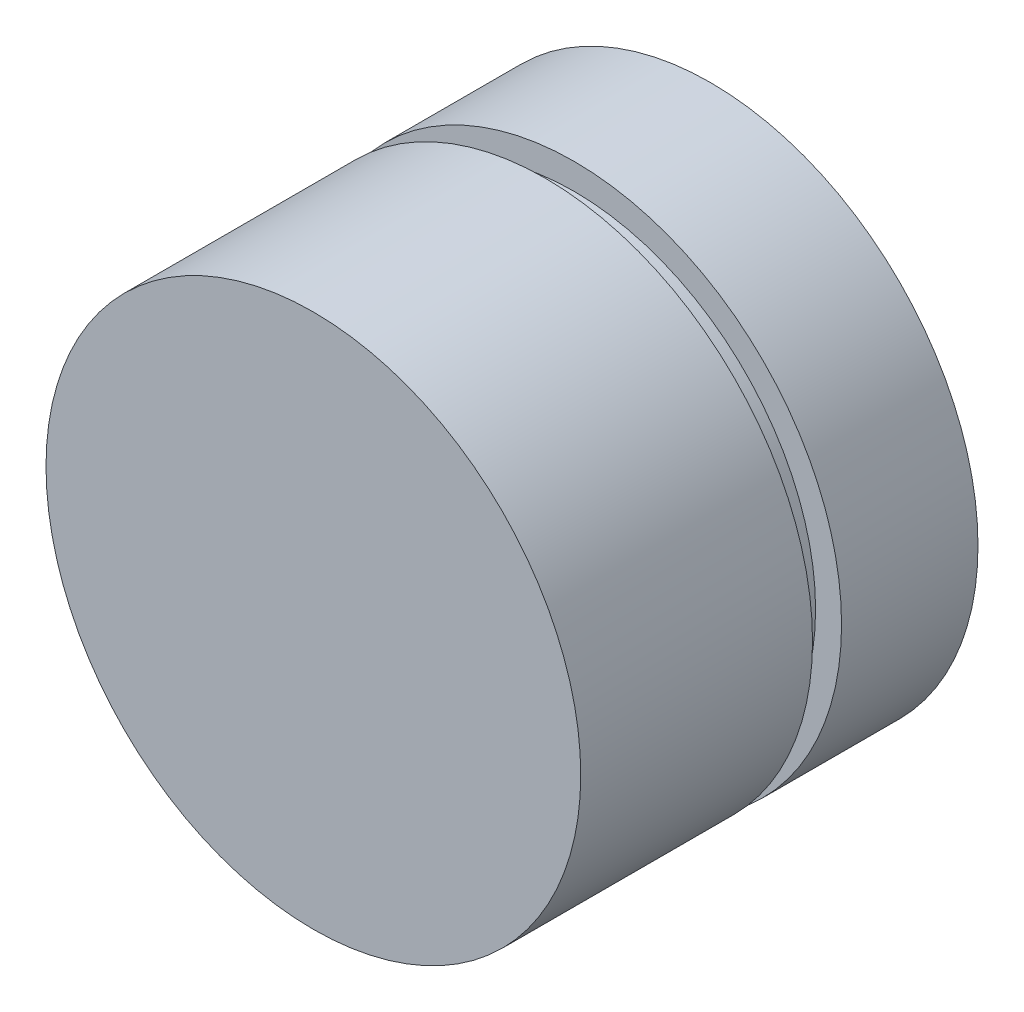
ISO-10303-21;
HEADER;
FILE_DESCRIPTION(('STEP AP214'),'2;1');
FILE_NAME('part.step','',(''),(''),'','','');
FILE_SCHEMA(('AUTOMOTIVE_DESIGN { 1 0 10303 214 1 1 1 1 }'));
ENDSEC;
DATA;
#1=APPLICATION_CONTEXT('core data for automotive mechanical design processes');
#2=APPLICATION_PROTOCOL_DEFINITION('international standard','automotive_design',2000,#1);
#3=PRODUCT_CONTEXT('',#1,'mechanical');
#4=PRODUCT('Part','Part','',(#3));
#5=PRODUCT_RELATED_PRODUCT_CATEGORY('part','',(#4));
#6=PRODUCT_DEFINITION_FORMATION('','',#4);
#7=PRODUCT_DEFINITION_CONTEXT('part definition',#1,'design');
#8=PRODUCT_DEFINITION('design','',#6,#7);
#9=PRODUCT_DEFINITION_SHAPE('','',#8);
#10=(LENGTH_UNIT() NAMED_UNIT(*) SI_UNIT(.MILLI.,.METRE.));
#11=(NAMED_UNIT(*) PLANE_ANGLE_UNIT() SI_UNIT($,.RADIAN.));
#12=(NAMED_UNIT(*) SI_UNIT($,.STERADIAN.) SOLID_ANGLE_UNIT());
#13=UNCERTAINTY_MEASURE_WITH_UNIT(LENGTH_MEASURE(1.E-05),#10,'distance_accuracy_value','');
#14=(GEOMETRIC_REPRESENTATION_CONTEXT(3) GLOBAL_UNCERTAINTY_ASSIGNED_CONTEXT((#13)) GLOBAL_UNIT_ASSIGNED_CONTEXT((#10,
#11,#12)) REPRESENTATION_CONTEXT('',''));
#15=CARTESIAN_POINT('',(0.,0.,0.));
#16=DIRECTION('',(0.,0.,1.));
#17=DIRECTION('',(1.,0.,0.));
#18=AXIS2_PLACEMENT_3D('',#15,#16,#17);
#19=CARTESIAN_POINT('',(0.,0.,-11.1133136236691));
#20=DIRECTION('',(0.,0.,1.));
#21=DIRECTION('',(1.,0.,0.));
#22=AXIS2_PLACEMENT_3D('',#19,#20,#21);
#23=PLANE('',#22);
#24=CARTESIAN_POINT('',(0.,0.,-11.1133136236691));
#25=DIRECTION('',(0.,0.,1.));
#26=DIRECTION('',(1.,0.,0.));
#27=AXIS2_PLACEMENT_3D('',#24,#25,#26);
#28=CIRCLE('',#27,5.);
#29=CARTESIAN_POINT('',(5.,0.,-11.1133136236691));
#30=VERTEX_POINT('',#29);
#31=EDGE_CURVE('E11',#30,#30,#28,.T.);
#32=ORIENTED_EDGE('',*,*,#31,.T.);
#33=EDGE_LOOP('',(#32));
#34=FACE_BOUND('',#33,.T.);
#35=ADVANCED_FACE('F44',(#34),#23,.T.);
#36=CARTESIAN_POINT('',(0.,0.,0.));
#37=DIRECTION('',(0.,0.,1.));
#38=DIRECTION('',(1.,0.,0.));
#39=AXIS2_PLACEMENT_3D('',#36,#37,#38);
#40=CYLINDRICAL_SURFACE('',#39,5.);
#41=CARTESIAN_POINT('',(0.,0.,-17.2133136236691));
#42=DIRECTION('',(0.,0.,1.));
#43=DIRECTION('',(1.,0.,0.));
#44=AXIS2_PLACEMENT_3D('',#41,#42,#43);
#45=CIRCLE('',#44,5.);
#46=CARTESIAN_POINT('',(5.,0.,-17.2133136236691));
#47=VERTEX_POINT('',#46);
#48=EDGE_CURVE('E50',#47,#47,#45,.T.);
#49=ORIENTED_EDGE('',*,*,#48,.T.);
#50=EDGE_LOOP('',(#49));
#51=FACE_BOUND('',#50,.T.);
#52=ORIENTED_EDGE('',*,*,#31,.F.);
#53=EDGE_LOOP('',(#52));
#54=FACE_BOUND('',#53,.T.);
#55=ADVANCED_FACE('F56',(#51,#54),#40,.T.);
#56=CARTESIAN_POINT('',(0.,0.,-17.2133136236691));
#57=DIRECTION('',(0.,0.,1.));
#58=DIRECTION('',(1.,0.,0.));
#59=AXIS2_PLACEMENT_3D('',#56,#57,#58);
#60=PLANE('',#59);
#61=ORIENTED_EDGE('',*,*,#48,.F.);
#62=EDGE_LOOP('',(#61));
#63=FACE_BOUND('',#62,.T.);
#64=ADVANCED_FACE('F59',(#63),#60,.F.);
#65=CLOSED_SHELL('',(#35,#55,#64));
#66=MANIFOLD_SOLID_BREP('B2',#65);
#67=CARTESIAN_POINT('',(0.,0.,0.));
#68=DIRECTION('',(0.,0.,1.));
#69=DIRECTION('',(1.,0.,0.));
#70=AXIS2_PLACEMENT_3D('',#67,#68,#69);
#71=PLANE('',#70);
#72=CARTESIAN_POINT('',(0.,0.,0.));
#73=DIRECTION('',(0.,0.,1.));
#74=DIRECTION('',(1.,0.,0.));
#75=AXIS2_PLACEMENT_3D('',#72,#73,#74);
#76=CIRCLE('',#75,17.5);
#77=CARTESIAN_POINT('',(17.5,0.,0.));
#78=VERTEX_POINT('',#77);
#79=EDGE_CURVE('E42',#78,#78,#76,.T.);
#80=ORIENTED_EDGE('',*,*,#79,.T.);
#81=EDGE_LOOP('',(#80));
#82=FACE_BOUND('',#81,.T.);
#83=ADVANCED_FACE('F87',(#82),#71,.T.);
#84=CARTESIAN_POINT('',(0.,0.,0.));
#85=DIRECTION('',(0.,0.,1.));
#86=DIRECTION('',(1.,0.,0.));
#87=AXIS2_PLACEMENT_3D('',#84,#85,#86);
#88=CYLINDRICAL_SURFACE('',#87,17.5);
#89=CARTESIAN_POINT('',(0.,0.,-15.1698369565217));
#90=DIRECTION('',(0.,0.,1.));
#91=DIRECTION('',(1.,0.,0.));
#92=AXIS2_PLACEMENT_3D('',#89,#90,#91);
#93=CIRCLE('',#92,17.5);
#94=CARTESIAN_POINT('',(17.5,0.,-15.1698369565217));
#95=VERTEX_POINT('',#94);
#96=EDGE_CURVE('E94',#95,#95,#93,.T.);
#97=ORIENTED_EDGE('',*,*,#96,.T.);
#98=EDGE_LOOP('',(#97));
#99=FACE_BOUND('',#98,.T.);
#100=ORIENTED_EDGE('',*,*,#79,.F.);
#101=EDGE_LOOP('',(#100));
#102=FACE_BOUND('',#101,.T.);
#103=ADVANCED_FACE('F115',(#99,#102),#88,.T.);
#104=CARTESIAN_POINT('',(17.5,0.,-15.1698369565217));
#105=DIRECTION('',(0.,0.,-1.));
#106=DIRECTION('',(-1.,0.,0.));
#107=AXIS2_PLACEMENT_3D('',#104,#105,#106);
#108=PLANE('',#107);
#109=CARTESIAN_POINT('',(0.,0.,-15.1698369565217));
#110=DIRECTION('',(0.,0.,1.));
#111=DIRECTION('',(1.,0.,0.));
#112=AXIS2_PLACEMENT_3D('',#109,#110,#111);
#113=CIRCLE('',#112,15.8);
#114=CARTESIAN_POINT('',(15.8,0.,-15.1698369565217));
#115=VERTEX_POINT('',#114);
#116=EDGE_CURVE('E153',#115,#115,#113,.T.);
#117=ORIENTED_EDGE('',*,*,#116,.T.);
#118=EDGE_LOOP('',(#117));
#119=FACE_BOUND('',#118,.T.);
#120=ORIENTED_EDGE('',*,*,#96,.F.);
#121=EDGE_LOOP('',(#120));
#122=FACE_BOUND('',#121,.T.);
#123=ADVANCED_FACE('F120',(#119,#122),#108,.T.);
#124=CARTESIAN_POINT('',(0.,0.,0.));
#125=DIRECTION('',(0.,0.,1.));
#126=DIRECTION('',(1.,0.,0.));
#127=AXIS2_PLACEMENT_3D('',#124,#125,#126);
#128=CYLINDRICAL_SURFACE('',#127,15.8);
#129=CARTESIAN_POINT('',(0.,0.,-17.0698369565217));
#130=DIRECTION('',(0.,0.,1.));
#131=DIRECTION('',(1.,0.,0.));
#132=AXIS2_PLACEMENT_3D('',#129,#130,#131);
#133=CIRCLE('',#132,15.8);
#134=CARTESIAN_POINT('',(15.8,0.,-17.0698369565217));
#135=VERTEX_POINT('',#134);
#136=EDGE_CURVE('E150',#135,#135,#133,.T.);
#137=ORIENTED_EDGE('',*,*,#136,.T.);
#138=EDGE_LOOP('',(#137));
#139=FACE_BOUND('',#138,.T.);
#140=ORIENTED_EDGE('',*,*,#116,.F.);
#141=EDGE_LOOP('',(#140));
#142=FACE_BOUND('',#141,.T.);
#143=ADVANCED_FACE('F127',(#139,#142),#128,.T.);
#144=CARTESIAN_POINT('',(15.8,0.,-17.0698369565217));
#145=DIRECTION('',(0.,0.,1.));
#146=DIRECTION('',(1.,0.,0.));
#147=AXIS2_PLACEMENT_3D('',#144,#145,#146);
#148=PLANE('',#147);
#149=CARTESIAN_POINT('',(0.,0.,-17.0698369565217));
#150=DIRECTION('',(0.,0.,1.));
#151=DIRECTION('',(1.,0.,0.));
#152=AXIS2_PLACEMENT_3D('',#149,#150,#151);
#153=CIRCLE('',#152,17.5);
#154=CARTESIAN_POINT('',(17.5,0.,-17.0698369565217));
#155=VERTEX_POINT('',#154);
#156=EDGE_CURVE('E149',#155,#155,#153,.T.);
#157=ORIENTED_EDGE('',*,*,#156,.T.);
#158=EDGE_LOOP('',(#157));
#159=FACE_BOUND('',#158,.T.);
#160=ORIENTED_EDGE('',*,*,#136,.F.);
#161=EDGE_LOOP('',(#160));
#162=FACE_BOUND('',#161,.T.);
#163=ADVANCED_FACE('F134',(#159,#162),#148,.T.);
#164=CARTESIAN_POINT('',(0.,0.,0.));
#165=DIRECTION('',(0.,0.,1.));
#166=DIRECTION('',(1.,0.,0.));
#167=AXIS2_PLACEMENT_3D('',#164,#165,#166);
#168=CYLINDRICAL_SURFACE('',#167,17.5);
#169=CARTESIAN_POINT('',(0.,0.,-26.));
#170=DIRECTION('',(0.,0.,1.));
#171=DIRECTION('',(1.,0.,0.));
#172=AXIS2_PLACEMENT_3D('',#169,#170,#171);
#173=CIRCLE('',#172,17.5);
#174=CARTESIAN_POINT('',(17.5,0.,-26.));
#175=VERTEX_POINT('',#174);
#176=EDGE_CURVE('E146',#175,#175,#173,.T.);
#177=ORIENTED_EDGE('',*,*,#176,.T.);
#178=EDGE_LOOP('',(#177));
#179=FACE_BOUND('',#178,.T.);
#180=ORIENTED_EDGE('',*,*,#156,.F.);
#181=EDGE_LOOP('',(#180));
#182=FACE_BOUND('',#181,.T.);
#183=ADVANCED_FACE('F110',(#179,#182),#168,.T.);
#184=CARTESIAN_POINT('',(17.5,0.,-26.));
#185=DIRECTION('',(0.,0.,-1.));
#186=DIRECTION('',(-1.,0.,0.));
#187=AXIS2_PLACEMENT_3D('',#184,#185,#186);
#188=PLANE('',#187);
#189=CARTESIAN_POINT('',(0.,0.,-26.));
#190=DIRECTION('',(0.,0.,-1.));
#191=DIRECTION('',(-1.,0.,0.));
#192=AXIS2_PLACEMENT_3D('',#189,#190,#191);
#193=CIRCLE('',#192,15.6);
#194=CARTESIAN_POINT('',(-15.6,0.,-26.));
#195=VERTEX_POINT('',#194);
#196=EDGE_CURVE('E90',#195,#195,#193,.T.);
#197=ORIENTED_EDGE('',*,*,#196,.F.);
#198=EDGE_LOOP('',(#197));
#199=FACE_BOUND('',#198,.T.);
#200=ORIENTED_EDGE('',*,*,#176,.F.);
#201=EDGE_LOOP('',(#200));
#202=FACE_BOUND('',#201,.T.);
#203=ADVANCED_FACE('F100',(#199,#202),#188,.T.);
#204=CARTESIAN_POINT('',(0.,0.,-11.1133136236691));
#205=DIRECTION('',(0.,0.,1.));
#206=DIRECTION('',(1.,0.,0.));
#207=AXIS2_PLACEMENT_3D('',#204,#205,#206);
#208=CONICAL_SURFACE('',#207,0.,1.57031672943725);
#209=CARTESIAN_POINT('',(0.,0.,-11.1066568118345));
#210=DIRECTION('',(0.,0.,1.));
#211=DIRECTION('',(1.,0.,0.));
#212=AXIS2_PLACEMENT_3D('',#209,#210,#211);
#213=CIRCLE('',#212,13.88);
#214=CARTESIAN_POINT('',(13.88,0.,-11.1066568118345));
#215=VERTEX_POINT('',#214);
#216=EDGE_CURVE('E164',#215,#215,#213,.T.);
#217=ORIENTED_EDGE('',*,*,#216,.F.);
#218=EDGE_LOOP('',(#217));
#219=FACE_BOUND('',#218,.T.);
#220=CARTESIAN_POINT('',(0.,0.,-11.1133136236691));
#221=VERTEX_POINT('',#220);
#222=VERTEX_LOOP('',#221);
#223=FACE_BOUND('',#222,.T.);
#224=ADVANCED_FACE('F97',(#219,#223),#208,.T.);
#225=CARTESIAN_POINT('',(0.,0.,-11.1066568118345));
#226=DIRECTION('',(0.,0.,-1.));
#227=DIRECTION('',(-1.,0.,0.));
#228=AXIS2_PLACEMENT_3D('',#225,#226,#227);
#229=CONICAL_SURFACE('',#228,13.88,0.274547210916387);
#230=CARTESIAN_POINT('',(0.,0.,-17.2133136236691));
#231=DIRECTION('',(0.,0.,1.));
#232=DIRECTION('',(1.,0.,0.));
#233=AXIS2_PLACEMENT_3D('',#230,#231,#232);
#234=CIRCLE('',#233,15.6);
#235=CARTESIAN_POINT('',(15.6,0.,-17.2133136236691));
#236=VERTEX_POINT('',#235);
#237=EDGE_CURVE('E167',#236,#236,#234,.T.);
#238=ORIENTED_EDGE('',*,*,#237,.F.);
#239=EDGE_LOOP('',(#238));
#240=FACE_BOUND('',#239,.T.);
#241=ORIENTED_EDGE('',*,*,#216,.T.);
#242=EDGE_LOOP('',(#241));
#243=FACE_BOUND('',#242,.T.);
#244=ADVANCED_FACE('F99',(#240,#243),#229,.F.);
#245=CARTESIAN_POINT('',(0.,0.,0.));
#246=DIRECTION('',(0.,0.,1.));
#247=DIRECTION('',(1.,0.,0.));
#248=AXIS2_PLACEMENT_3D('',#245,#246,#247);
#249=CYLINDRICAL_SURFACE('',#248,15.6);
#250=ORIENTED_EDGE('',*,*,#196,.T.);
#251=EDGE_LOOP('',(#250));
#252=FACE_BOUND('',#251,.T.);
#253=ORIENTED_EDGE('',*,*,#237,.T.);
#254=EDGE_LOOP('',(#253));
#255=FACE_BOUND('',#254,.T.);
#256=ADVANCED_FACE('F107',(#252,#255),#249,.F.);
#257=CLOSED_SHELL('',(#83,#103,#123,#143,#163,#183,#203,#224,#244,#256));
#258=MANIFOLD_SOLID_BREP('B6',#257);
#259=ADVANCED_BREP_SHAPE_REPRESENTATION('',(#18,#66,#258),#14);
#260=SHAPE_DEFINITION_REPRESENTATION(#9,#259);
ENDSEC;
END-ISO-10303-21;
